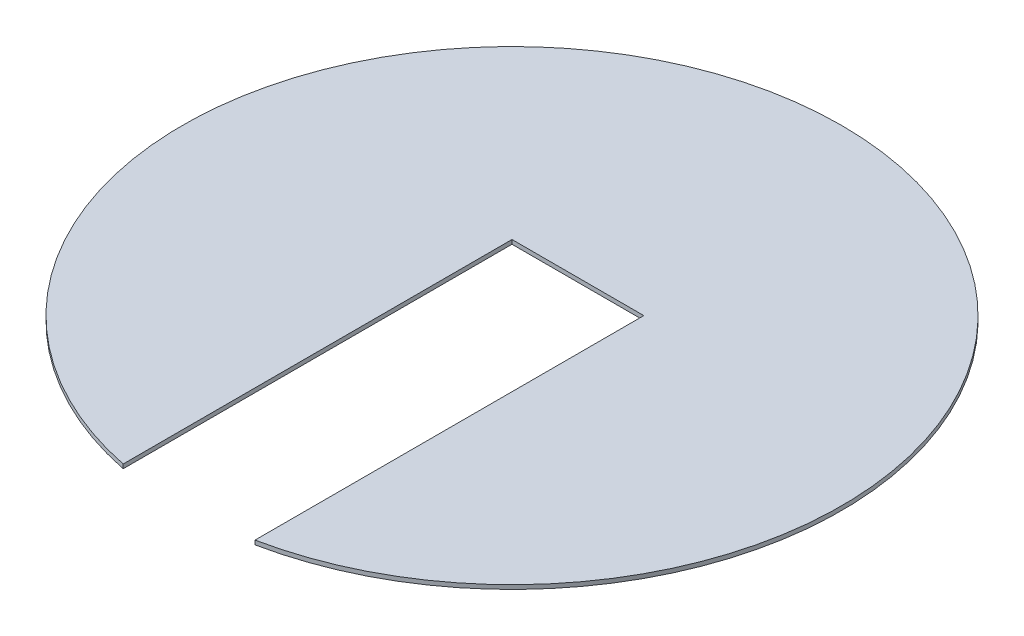
ISO-10303-21;
HEADER;
FILE_DESCRIPTION(('STEP AP214'),'2;1');
FILE_NAME('part.step','',(''),(''),'','','');
FILE_SCHEMA(('AUTOMOTIVE_DESIGN { 1 0 10303 214 1 1 1 1 }'));
ENDSEC;
DATA;
#1=APPLICATION_CONTEXT('core data for automotive mechanical design processes');
#2=APPLICATION_PROTOCOL_DEFINITION('international standard','automotive_design',2000,#1);
#3=PRODUCT_CONTEXT('',#1,'mechanical');
#4=PRODUCT('Part','Part','',(#3));
#5=PRODUCT_RELATED_PRODUCT_CATEGORY('part','',(#4));
#6=PRODUCT_DEFINITION_FORMATION('','',#4);
#7=PRODUCT_DEFINITION_CONTEXT('part definition',#1,'design');
#8=PRODUCT_DEFINITION('design','',#6,#7);
#9=PRODUCT_DEFINITION_SHAPE('','',#8);
#10=(LENGTH_UNIT() NAMED_UNIT(*) SI_UNIT(.MILLI.,.METRE.));
#11=(NAMED_UNIT(*) PLANE_ANGLE_UNIT() SI_UNIT($,.RADIAN.));
#12=(NAMED_UNIT(*) SI_UNIT($,.STERADIAN.) SOLID_ANGLE_UNIT());
#13=UNCERTAINTY_MEASURE_WITH_UNIT(LENGTH_MEASURE(1.E-05),#10,'distance_accuracy_value','');
#14=(GEOMETRIC_REPRESENTATION_CONTEXT(3) GLOBAL_UNCERTAINTY_ASSIGNED_CONTEXT((#13)) GLOBAL_UNIT_ASSIGNED_CONTEXT((#10,
#11,#12)) REPRESENTATION_CONTEXT('',''));
#15=CARTESIAN_POINT('',(0.,0.,0.));
#16=DIRECTION('',(0.,0.,1.));
#17=DIRECTION('',(1.,0.,0.));
#18=AXIS2_PLACEMENT_3D('',#15,#16,#17);
#19=CARTESIAN_POINT('',(0.,1.6002,0.));
#20=DIRECTION('',(0.,1.,0.));
#21=DIRECTION('',(0.,0.,1.));
#22=AXIS2_PLACEMENT_3D('',#19,#20,#21);
#23=PLANE('',#22);
#24=CARTESIAN_POINT('',(0.,1.6002,0.));
#25=DIRECTION('',(0.,1.,0.));
#26=DIRECTION('',(0.,0.,1.));
#27=AXIS2_PLACEMENT_3D('',#24,#25,#26);
#28=CIRCLE('',#27,127.);
#29=CARTESIAN_POINT('',(-25.4,1.6002,124.434078933381));
#30=VERTEX_POINT('',#29);
#31=CARTESIAN_POINT('',(25.4000000000009,1.6002,124.434078933385));
#32=VERTEX_POINT('',#31);
#33=EDGE_CURVE('E36',#30,#32,#28,.F.);
#34=ORIENTED_EDGE('',*,*,#33,.F.);
#35=DIRECTION('',(0.,0.,1.));
#36=VECTOR('',#35,1.);
#37=CARTESIAN_POINT('',(-25.4,1.6002,-25.4));
#38=LINE('',#37,#36);
#39=CARTESIAN_POINT('',(-25.4,1.6002,-25.4));
#40=VERTEX_POINT('',#39);
#41=EDGE_CURVE('E91',#30,#40,#38,.F.);
#42=ORIENTED_EDGE('',*,*,#41,.T.);
#43=DIRECTION('',(-1.,0.,0.));
#44=VECTOR('',#43,1.);
#45=CARTESIAN_POINT('',(25.4,1.6002,-25.4));
#46=LINE('',#45,#44);
#47=CARTESIAN_POINT('',(25.4,1.6002,-25.4));
#48=VERTEX_POINT('',#47);
#49=EDGE_CURVE('E81',#40,#48,#46,.F.);
#50=ORIENTED_EDGE('',*,*,#49,.T.);
#51=DIRECTION('',(0.,0.,-1.));
#52=VECTOR('',#51,1.);
#53=CARTESIAN_POINT('',(25.4,1.6002,330.2));
#54=LINE('',#53,#52);
#55=EDGE_CURVE('E79',#48,#32,#54,.F.);
#56=ORIENTED_EDGE('',*,*,#55,.T.);
#57=EDGE_LOOP('',(#34,#42,#50,#56));
#58=FACE_BOUND('',#57,.T.);
#59=ADVANCED_FACE('F33',(#58),#23,.T.);
#60=CARTESIAN_POINT('',(25.4,1.6002,330.2));
#61=DIRECTION('',(1.,0.,0.));
#62=DIRECTION('',(0.,0.,-1.));
#63=AXIS2_PLACEMENT_3D('',#60,#61,#62);
#64=PLANE('',#63);
#65=DIRECTION('',(0.,1.,0.));
#66=VECTOR('',#65,1.);
#67=CARTESIAN_POINT('',(25.4000000000018,0.,124.434078933385));
#68=LINE('',#67,#66);
#69=CARTESIAN_POINT('',(25.4000000000009,0.,124.434078933385));
#70=VERTEX_POINT('',#69);
#71=EDGE_CURVE('E76',#32,#70,#68,.F.);
#72=ORIENTED_EDGE('',*,*,#71,.F.);
#73=ORIENTED_EDGE('',*,*,#55,.F.);
#74=DIRECTION('',(0.,1.,0.));
#75=VECTOR('',#74,1.);
#76=CARTESIAN_POINT('',(25.4,1.6002,-25.4));
#77=LINE('',#76,#75);
#78=CARTESIAN_POINT('',(25.4,0.,-25.4));
#79=VERTEX_POINT('',#78);
#80=EDGE_CURVE('E97',#48,#79,#77,.F.);
#81=ORIENTED_EDGE('',*,*,#80,.T.);
#82=DIRECTION('',(0.,0.,1.));
#83=VECTOR('',#82,1.);
#84=CARTESIAN_POINT('',(25.4,0.,0.));
#85=LINE('',#84,#83);
#86=EDGE_CURVE('E89',#79,#70,#85,.T.);
#87=ORIENTED_EDGE('',*,*,#86,.T.);
#88=EDGE_LOOP('',(#72,#73,#81,#87));
#89=FACE_BOUND('',#88,.T.);
#90=ADVANCED_FACE('F87',(#89),#64,.F.);
#91=CARTESIAN_POINT('',(0.,0.,0.));
#92=DIRECTION('',(0.,1.,0.));
#93=DIRECTION('',(0.,0.,1.));
#94=AXIS2_PLACEMENT_3D('',#91,#92,#93);
#95=CYLINDRICAL_SURFACE('',#94,127.);
#96=ORIENTED_EDGE('',*,*,#33,.T.);
#97=ORIENTED_EDGE('',*,*,#71,.T.);
#98=CARTESIAN_POINT('',(0.,0.,0.));
#99=DIRECTION('',(0.,1.,0.));
#100=DIRECTION('',(0.,0.,1.));
#101=AXIS2_PLACEMENT_3D('',#98,#99,#100);
#102=CIRCLE('',#101,127.);
#103=CARTESIAN_POINT('',(-25.4,0.,124.434078933381));
#104=VERTEX_POINT('',#103);
#105=EDGE_CURVE('E108',#70,#104,#102,.T.);
#106=ORIENTED_EDGE('',*,*,#105,.T.);
#107=DIRECTION('',(0.,1.,0.));
#108=VECTOR('',#107,1.);
#109=CARTESIAN_POINT('',(-25.4,1.6002,124.434078933376));
#110=LINE('',#109,#108);
#111=EDGE_CURVE('E78',#104,#30,#110,.T.);
#112=ORIENTED_EDGE('',*,*,#111,.T.);
#113=EDGE_LOOP('',(#96,#97,#106,#112));
#114=FACE_BOUND('',#113,.T.);
#115=ADVANCED_FACE('F73',(#114),#95,.T.);
#116=CARTESIAN_POINT('',(-25.4,1.6002,-25.4));
#117=DIRECTION('',(-1.,0.,0.));
#118=DIRECTION('',(0.,0.,1.));
#119=AXIS2_PLACEMENT_3D('',#116,#117,#118);
#120=PLANE('',#119);
#121=DIRECTION('',(0.,1.,0.));
#122=VECTOR('',#121,1.);
#123=CARTESIAN_POINT('',(-25.4,1.6002,-25.4));
#124=LINE('',#123,#122);
#125=CARTESIAN_POINT('',(-25.4,0.,-25.4));
#126=VERTEX_POINT('',#125);
#127=EDGE_CURVE('E50',#126,#40,#124,.T.);
#128=ORIENTED_EDGE('',*,*,#127,.T.);
#129=ORIENTED_EDGE('',*,*,#41,.F.);
#130=ORIENTED_EDGE('',*,*,#111,.F.);
#131=DIRECTION('',(0.,0.,1.));
#132=VECTOR('',#131,1.);
#133=CARTESIAN_POINT('',(-25.4,0.,0.));
#134=LINE('',#133,#132);
#135=EDGE_CURVE('E42',#104,#126,#134,.F.);
#136=ORIENTED_EDGE('',*,*,#135,.T.);
#137=EDGE_LOOP('',(#128,#129,#130,#136));
#138=FACE_BOUND('',#137,.T.);
#139=ADVANCED_FACE('F119',(#138),#120,.F.);
#140=CARTESIAN_POINT('',(25.4,1.6002,-25.4));
#141=DIRECTION('',(0.,0.,-1.));
#142=DIRECTION('',(-1.,0.,0.));
#143=AXIS2_PLACEMENT_3D('',#140,#141,#142);
#144=PLANE('',#143);
#145=ORIENTED_EDGE('',*,*,#80,.F.);
#146=ORIENTED_EDGE('',*,*,#49,.F.);
#147=ORIENTED_EDGE('',*,*,#127,.F.);
#148=DIRECTION('',(1.,0.,0.));
#149=VECTOR('',#148,1.);
#150=CARTESIAN_POINT('',(0.,0.,-25.4));
#151=LINE('',#150,#149);
#152=EDGE_CURVE('E11',#126,#79,#151,.T.);
#153=ORIENTED_EDGE('',*,*,#152,.T.);
#154=EDGE_LOOP('',(#145,#146,#147,#153));
#155=FACE_BOUND('',#154,.T.);
#156=ADVANCED_FACE('F123',(#155),#144,.F.);
#157=CARTESIAN_POINT('',(0.,0.,0.));
#158=DIRECTION('',(0.,1.,0.));
#159=DIRECTION('',(0.,0.,1.));
#160=AXIS2_PLACEMENT_3D('',#157,#158,#159);
#161=PLANE('',#160);
#162=ORIENTED_EDGE('',*,*,#135,.F.);
#163=ORIENTED_EDGE('',*,*,#105,.F.);
#164=ORIENTED_EDGE('',*,*,#86,.F.);
#165=ORIENTED_EDGE('',*,*,#152,.F.);
#166=EDGE_LOOP('',(#162,#163,#164,#165));
#167=FACE_BOUND('',#166,.T.);
#168=ADVANCED_FACE('F122',(#167),#161,.F.);
#169=CLOSED_SHELL('',(#59,#90,#115,#139,#156,#168));
#170=MANIFOLD_SOLID_BREP('B2',#169);
#171=ADVANCED_BREP_SHAPE_REPRESENTATION('',(#18,#170),#14);
#172=SHAPE_DEFINITION_REPRESENTATION(#9,#171);
ENDSEC;
END-ISO-10303-21;
